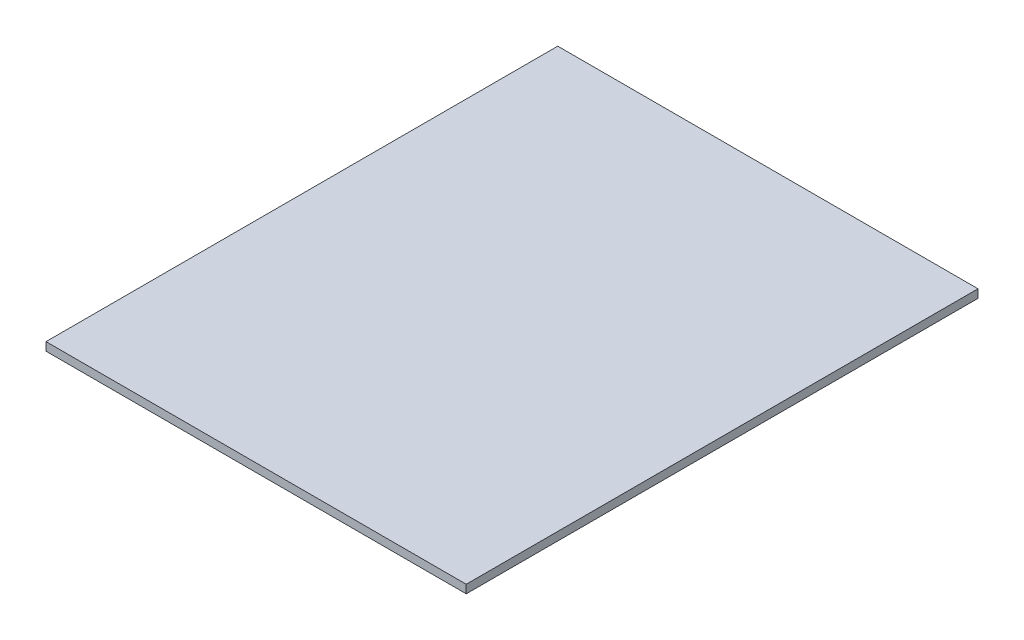
ISO-10303-21;
HEADER;
FILE_DESCRIPTION(('STEP AP214'),'2;1');
FILE_NAME('part.step','',(''),(''),'','','');
FILE_SCHEMA(('AUTOMOTIVE_DESIGN { 1 0 10303 214 1 1 1 1 }'));
ENDSEC;
DATA;
#1=APPLICATION_CONTEXT('core data for automotive mechanical design processes');
#2=APPLICATION_PROTOCOL_DEFINITION('international standard','automotive_design',2000,#1);
#3=PRODUCT_CONTEXT('',#1,'mechanical');
#4=PRODUCT('Part','Part','',(#3));
#5=PRODUCT_RELATED_PRODUCT_CATEGORY('part','',(#4));
#6=PRODUCT_DEFINITION_FORMATION('','',#4);
#7=PRODUCT_DEFINITION_CONTEXT('part definition',#1,'design');
#8=PRODUCT_DEFINITION('design','',#6,#7);
#9=PRODUCT_DEFINITION_SHAPE('','',#8);
#10=(LENGTH_UNIT() NAMED_UNIT(*) SI_UNIT(.MILLI.,.METRE.));
#11=(NAMED_UNIT(*) PLANE_ANGLE_UNIT() SI_UNIT($,.RADIAN.));
#12=(NAMED_UNIT(*) SI_UNIT($,.STERADIAN.) SOLID_ANGLE_UNIT());
#13=UNCERTAINTY_MEASURE_WITH_UNIT(LENGTH_MEASURE(1.E-05),#10,'distance_accuracy_value','');
#14=(GEOMETRIC_REPRESENTATION_CONTEXT(3) GLOBAL_UNCERTAINTY_ASSIGNED_CONTEXT((#13)) GLOBAL_UNIT_ASSIGNED_CONTEXT((#10,
#11,#12)) REPRESENTATION_CONTEXT('',''));
#15=CARTESIAN_POINT('',(0.,0.,0.));
#16=DIRECTION('',(0.,0.,1.));
#17=DIRECTION('',(1.,0.,0.));
#18=AXIS2_PLACEMENT_3D('',#15,#16,#17);
#19=CARTESIAN_POINT('',(0.,8.,0.));
#20=DIRECTION('',(0.,0.,-1.));
#21=DIRECTION('',(-1.,0.,0.));
#22=AXIS2_PLACEMENT_3D('',#19,#20,#21);
#23=PLANE('',#22);
#24=DIRECTION('',(1.,0.,0.));
#25=VECTOR('',#24,1.);
#26=CARTESIAN_POINT('',(0.,0.,0.));
#27=LINE('',#26,#25);
#28=CARTESIAN_POINT('',(0.,0.,0.));
#29=VERTEX_POINT('',#28);
#30=CARTESIAN_POINT('',(404.,0.,0.));
#31=VERTEX_POINT('',#30);
#32=EDGE_CURVE('E104',#29,#31,#27,.T.);
#33=ORIENTED_EDGE('',*,*,#32,.F.);
#34=DIRECTION('',(0.,-1.,0.));
#35=VECTOR('',#34,1.);
#36=CARTESIAN_POINT('',(0.,8.,0.));
#37=LINE('',#36,#35);
#38=CARTESIAN_POINT('',(0.,8.,0.));
#39=VERTEX_POINT('',#38);
#40=EDGE_CURVE('E11',#39,#29,#37,.T.);
#41=ORIENTED_EDGE('',*,*,#40,.F.);
#42=DIRECTION('',(1.,0.,0.));
#43=VECTOR('',#42,1.);
#44=CARTESIAN_POINT('',(0.,8.,0.));
#45=LINE('',#44,#43);
#46=CARTESIAN_POINT('',(404.,8.,0.));
#47=VERTEX_POINT('',#46);
#48=EDGE_CURVE('E99',#39,#47,#45,.T.);
#49=ORIENTED_EDGE('',*,*,#48,.T.);
#50=DIRECTION('',(0.,-1.,0.));
#51=VECTOR('',#50,1.);
#52=CARTESIAN_POINT('',(404.,8.,0.));
#53=LINE('',#52,#51);
#54=EDGE_CURVE('E42',#47,#31,#53,.T.);
#55=ORIENTED_EDGE('',*,*,#54,.T.);
#56=EDGE_LOOP('',(#33,#41,#49,#55));
#57=FACE_BOUND('',#56,.T.);
#58=ADVANCED_FACE('F39',(#57),#23,.T.);
#59=CARTESIAN_POINT('',(0.,8.,0.));
#60=DIRECTION('',(1.,0.,0.));
#61=DIRECTION('',(0.,0.,-1.));
#62=AXIS2_PLACEMENT_3D('',#59,#60,#61);
#63=PLANE('',#62);
#64=DIRECTION('',(0.,0.,1.));
#65=VECTOR('',#64,1.);
#66=CARTESIAN_POINT('',(0.,0.,0.));
#67=LINE('',#66,#65);
#68=CARTESIAN_POINT('',(0.,0.,492.));
#69=VERTEX_POINT('',#68);
#70=EDGE_CURVE('E72',#29,#69,#67,.T.);
#71=ORIENTED_EDGE('',*,*,#70,.T.);
#72=DIRECTION('',(0.,-1.,0.));
#73=VECTOR('',#72,1.);
#74=CARTESIAN_POINT('',(0.,8.,492.));
#75=LINE('',#74,#73);
#76=CARTESIAN_POINT('',(0.,8.,492.));
#77=VERTEX_POINT('',#76);
#78=EDGE_CURVE('E48',#77,#69,#75,.T.);
#79=ORIENTED_EDGE('',*,*,#78,.F.);
#80=DIRECTION('',(0.,0.,1.));
#81=VECTOR('',#80,1.);
#82=CARTESIAN_POINT('',(0.,8.,0.));
#83=LINE('',#82,#81);
#84=EDGE_CURVE('E89',#39,#77,#83,.T.);
#85=ORIENTED_EDGE('',*,*,#84,.F.);
#86=ORIENTED_EDGE('',*,*,#40,.T.);
#87=EDGE_LOOP('',(#71,#79,#85,#86));
#88=FACE_BOUND('',#87,.T.);
#89=ADVANCED_FACE('F114',(#88),#63,.F.);
#90=CARTESIAN_POINT('',(0.,8.,492.));
#91=DIRECTION('',(0.,0.,-1.));
#92=DIRECTION('',(-1.,0.,0.));
#93=AXIS2_PLACEMENT_3D('',#90,#91,#92);
#94=PLANE('',#93);
#95=DIRECTION('',(1.,0.,0.));
#96=VECTOR('',#95,1.);
#97=CARTESIAN_POINT('',(0.,0.,492.));
#98=LINE('',#97,#96);
#99=CARTESIAN_POINT('',(404.,0.,492.));
#100=VERTEX_POINT('',#99);
#101=EDGE_CURVE('E96',#69,#100,#98,.T.);
#102=ORIENTED_EDGE('',*,*,#101,.T.);
#103=DIRECTION('',(0.,-1.,0.));
#104=VECTOR('',#103,1.);
#105=CARTESIAN_POINT('',(404.,8.,492.));
#106=LINE('',#105,#104);
#107=CARTESIAN_POINT('',(404.,8.,492.));
#108=VERTEX_POINT('',#107);
#109=EDGE_CURVE('E93',#108,#100,#106,.T.);
#110=ORIENTED_EDGE('',*,*,#109,.F.);
#111=DIRECTION('',(1.,0.,0.));
#112=VECTOR('',#111,1.);
#113=CARTESIAN_POINT('',(0.,8.,492.));
#114=LINE('',#113,#112);
#115=EDGE_CURVE('E84',#77,#108,#114,.T.);
#116=ORIENTED_EDGE('',*,*,#115,.F.);
#117=ORIENTED_EDGE('',*,*,#78,.T.);
#118=EDGE_LOOP('',(#102,#110,#116,#117));
#119=FACE_BOUND('',#118,.T.);
#120=ADVANCED_FACE('F94',(#119),#94,.F.);
#121=CARTESIAN_POINT('',(404.,8.,0.));
#122=DIRECTION('',(1.,0.,0.));
#123=DIRECTION('',(0.,0.,-1.));
#124=AXIS2_PLACEMENT_3D('',#121,#122,#123);
#125=PLANE('',#124);
#126=DIRECTION('',(0.,0.,1.));
#127=VECTOR('',#126,1.);
#128=CARTESIAN_POINT('',(404.,0.,0.));
#129=LINE('',#128,#127);
#130=EDGE_CURVE('E107',#31,#100,#129,.T.);
#131=ORIENTED_EDGE('',*,*,#130,.F.);
#132=ORIENTED_EDGE('',*,*,#54,.F.);
#133=DIRECTION('',(0.,0.,1.));
#134=VECTOR('',#133,1.);
#135=CARTESIAN_POINT('',(404.,8.,0.));
#136=LINE('',#135,#134);
#137=EDGE_CURVE('E88',#47,#108,#136,.T.);
#138=ORIENTED_EDGE('',*,*,#137,.T.);
#139=ORIENTED_EDGE('',*,*,#109,.T.);
#140=EDGE_LOOP('',(#131,#132,#138,#139));
#141=FACE_BOUND('',#140,.T.);
#142=ADVANCED_FACE('F98',(#141),#125,.T.);
#143=CARTESIAN_POINT('',(0.,8.,0.));
#144=DIRECTION('',(0.,-1.,0.));
#145=DIRECTION('',(0.,0.,-1.));
#146=AXIS2_PLACEMENT_3D('',#143,#144,#145);
#147=PLANE('',#146);
#148=ORIENTED_EDGE('',*,*,#48,.F.);
#149=ORIENTED_EDGE('',*,*,#84,.T.);
#150=ORIENTED_EDGE('',*,*,#115,.T.);
#151=ORIENTED_EDGE('',*,*,#137,.F.);
#152=EDGE_LOOP('',(#148,#149,#150,#151));
#153=FACE_BOUND('',#152,.T.);
#154=ADVANCED_FACE('F87',(#153),#147,.F.);
#155=CARTESIAN_POINT('',(0.,0.,0.));
#156=DIRECTION('',(0.,-1.,0.));
#157=DIRECTION('',(0.,0.,-1.));
#158=AXIS2_PLACEMENT_3D('',#155,#156,#157);
#159=PLANE('',#158);
#160=ORIENTED_EDGE('',*,*,#32,.T.);
#161=ORIENTED_EDGE('',*,*,#130,.T.);
#162=ORIENTED_EDGE('',*,*,#101,.F.);
#163=ORIENTED_EDGE('',*,*,#70,.F.);
#164=EDGE_LOOP('',(#160,#161,#162,#163));
#165=FACE_BOUND('',#164,.T.);
#166=ADVANCED_FACE('F112',(#165),#159,.T.);
#167=CLOSED_SHELL('',(#58,#89,#120,#142,#154,#166));
#168=MANIFOLD_SOLID_BREP('B2',#167);
#169=ADVANCED_BREP_SHAPE_REPRESENTATION('',(#18,#168),#14);
#170=SHAPE_DEFINITION_REPRESENTATION(#9,#169);
ENDSEC;
END-ISO-10303-21;
